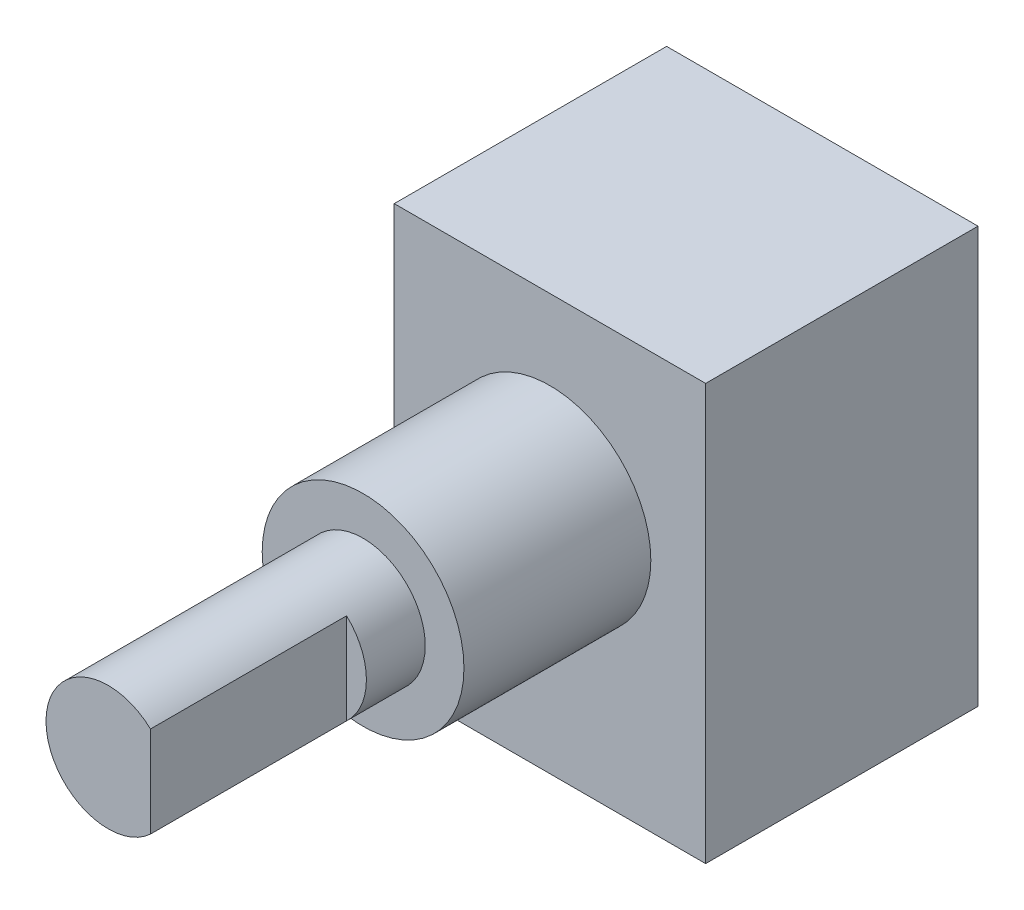
ISO-10303-21;
HEADER;
FILE_DESCRIPTION(('STEP AP214'),'2;1');
FILE_NAME('part.step','',(''),(''),'','','');
FILE_SCHEMA(('AUTOMOTIVE_DESIGN { 1 0 10303 214 1 1 1 1 }'));
ENDSEC;
DATA;
#1=APPLICATION_CONTEXT('core data for automotive mechanical design processes');
#2=APPLICATION_PROTOCOL_DEFINITION('international standard','automotive_design',2000,#1);
#3=PRODUCT_CONTEXT('',#1,'mechanical');
#4=PRODUCT('Part','Part','',(#3));
#5=PRODUCT_RELATED_PRODUCT_CATEGORY('part','',(#4));
#6=PRODUCT_DEFINITION_FORMATION('','',#4);
#7=PRODUCT_DEFINITION_CONTEXT('part definition',#1,'design');
#8=PRODUCT_DEFINITION('design','',#6,#7);
#9=PRODUCT_DEFINITION_SHAPE('','',#8);
#10=(LENGTH_UNIT() NAMED_UNIT(*) SI_UNIT(.MILLI.,.METRE.));
#11=(NAMED_UNIT(*) PLANE_ANGLE_UNIT() SI_UNIT($,.RADIAN.));
#12=(NAMED_UNIT(*) SI_UNIT($,.STERADIAN.) SOLID_ANGLE_UNIT());
#13=UNCERTAINTY_MEASURE_WITH_UNIT(LENGTH_MEASURE(1.E-05),#10,'distance_accuracy_value','');
#14=(GEOMETRIC_REPRESENTATION_CONTEXT(3) GLOBAL_UNCERTAINTY_ASSIGNED_CONTEXT((#13)) GLOBAL_UNIT_ASSIGNED_CONTEXT((#10,
#11,#12)) REPRESENTATION_CONTEXT('',''));
#15=CARTESIAN_POINT('',(0.,0.,0.));
#16=DIRECTION('',(0.,0.,1.));
#17=DIRECTION('',(1.,0.,0.));
#18=AXIS2_PLACEMENT_3D('',#15,#16,#17);
#19=CARTESIAN_POINT('',(0.,0.,13.89));
#20=DIRECTION('',(1.,0.,0.));
#21=DIRECTION('',(0.,0.,-1.));
#22=AXIS2_PLACEMENT_3D('',#19,#20,#21);
#23=PLANE('',#22);
#24=DIRECTION('',(0.,-1.,0.));
#25=VECTOR('',#24,1.);
#26=CARTESIAN_POINT('',(0.,0.,0.));
#27=LINE('',#26,#25);
#28=CARTESIAN_POINT('',(0.,21.21,0.));
#29=VERTEX_POINT('',#28);
#30=CARTESIAN_POINT('',(0.,0.,0.));
#31=VERTEX_POINT('',#30);
#32=EDGE_CURVE('E125',#29,#31,#27,.T.);
#33=ORIENTED_EDGE('',*,*,#32,.T.);
#34=DIRECTION('',(0.,0.,-1.));
#35=VECTOR('',#34,1.);
#36=CARTESIAN_POINT('',(0.,0.,13.89));
#37=LINE('',#36,#35);
#38=CARTESIAN_POINT('',(0.,0.,13.89));
#39=VERTEX_POINT('',#38);
#40=EDGE_CURVE('E134',#39,#31,#37,.T.);
#41=ORIENTED_EDGE('',*,*,#40,.F.);
#42=DIRECTION('',(0.,-1.,0.));
#43=VECTOR('',#42,1.);
#44=CARTESIAN_POINT('',(0.,0.,13.89));
#45=LINE('',#44,#43);
#46=CARTESIAN_POINT('',(0.,21.21,13.89));
#47=VERTEX_POINT('',#46);
#48=EDGE_CURVE('E135',#47,#39,#45,.T.);
#49=ORIENTED_EDGE('',*,*,#48,.F.);
#50=DIRECTION('',(0.,0.,-1.));
#51=VECTOR('',#50,1.);
#52=CARTESIAN_POINT('',(0.,21.21,13.89));
#53=LINE('',#52,#51);
#54=EDGE_CURVE('E145',#47,#29,#53,.T.);
#55=ORIENTED_EDGE('',*,*,#54,.T.);
#56=EDGE_LOOP('',(#33,#41,#49,#55));
#57=FACE_BOUND('',#56,.T.);
#58=ADVANCED_FACE('F41',(#57),#23,.F.);
#59=CARTESIAN_POINT('',(0.,0.,13.89));
#60=DIRECTION('',(0.,1.,0.));
#61=DIRECTION('',(0.,0.,1.));
#62=AXIS2_PLACEMENT_3D('',#59,#60,#61);
#63=PLANE('',#62);
#64=DIRECTION('',(1.,0.,0.));
#65=VECTOR('',#64,1.);
#66=CARTESIAN_POINT('',(0.,0.,0.));
#67=LINE('',#66,#65);
#68=CARTESIAN_POINT('',(15.88,0.,0.));
#69=VERTEX_POINT('',#68);
#70=EDGE_CURVE('E149',#31,#69,#67,.T.);
#71=ORIENTED_EDGE('',*,*,#70,.T.);
#72=DIRECTION('',(0.,0.,-1.));
#73=VECTOR('',#72,1.);
#74=CARTESIAN_POINT('',(15.88,0.,13.89));
#75=LINE('',#74,#73);
#76=CARTESIAN_POINT('',(15.88,0.,13.89));
#77=VERTEX_POINT('',#76);
#78=EDGE_CURVE('E162',#77,#69,#75,.T.);
#79=ORIENTED_EDGE('',*,*,#78,.F.);
#80=DIRECTION('',(1.,0.,0.));
#81=VECTOR('',#80,1.);
#82=CARTESIAN_POINT('',(0.,0.,13.89));
#83=LINE('',#82,#81);
#84=EDGE_CURVE('E94',#39,#77,#83,.T.);
#85=ORIENTED_EDGE('',*,*,#84,.F.);
#86=ORIENTED_EDGE('',*,*,#40,.T.);
#87=EDGE_LOOP('',(#71,#79,#85,#86));
#88=FACE_BOUND('',#87,.T.);
#89=ADVANCED_FACE('F168',(#88),#63,.F.);
#90=CARTESIAN_POINT('',(15.88,0.,13.89));
#91=DIRECTION('',(-1.,0.,0.));
#92=DIRECTION('',(0.,0.,1.));
#93=AXIS2_PLACEMENT_3D('',#90,#91,#92);
#94=PLANE('',#93);
#95=DIRECTION('',(0.,1.,0.));
#96=VECTOR('',#95,1.);
#97=CARTESIAN_POINT('',(15.88,0.,0.));
#98=LINE('',#97,#96);
#99=CARTESIAN_POINT('',(15.88,21.21,0.));
#100=VERTEX_POINT('',#99);
#101=EDGE_CURVE('E152',#69,#100,#98,.T.);
#102=ORIENTED_EDGE('',*,*,#101,.T.);
#103=DIRECTION('',(0.,0.,-1.));
#104=VECTOR('',#103,1.);
#105=CARTESIAN_POINT('',(15.88,21.21,13.89));
#106=LINE('',#105,#104);
#107=CARTESIAN_POINT('',(15.88,21.21,13.89));
#108=VERTEX_POINT('',#107);
#109=EDGE_CURVE('E159',#108,#100,#106,.T.);
#110=ORIENTED_EDGE('',*,*,#109,.F.);
#111=DIRECTION('',(0.,1.,0.));
#112=VECTOR('',#111,1.);
#113=CARTESIAN_POINT('',(15.88,0.,13.89));
#114=LINE('',#113,#112);
#115=EDGE_CURVE('E140',#77,#108,#114,.T.);
#116=ORIENTED_EDGE('',*,*,#115,.F.);
#117=ORIENTED_EDGE('',*,*,#78,.T.);
#118=EDGE_LOOP('',(#102,#110,#116,#117));
#119=FACE_BOUND('',#118,.T.);
#120=ADVANCED_FACE('F177',(#119),#94,.F.);
#121=CARTESIAN_POINT('',(0.,21.21,13.89));
#122=DIRECTION('',(0.,-1.,0.));
#123=DIRECTION('',(0.,0.,-1.));
#124=AXIS2_PLACEMENT_3D('',#121,#122,#123);
#125=PLANE('',#124);
#126=DIRECTION('',(-1.,0.,0.));
#127=VECTOR('',#126,1.);
#128=CARTESIAN_POINT('',(0.,21.21,0.));
#129=LINE('',#128,#127);
#130=EDGE_CURVE('E86',#100,#29,#129,.T.);
#131=ORIENTED_EDGE('',*,*,#130,.T.);
#132=ORIENTED_EDGE('',*,*,#54,.F.);
#133=DIRECTION('',(-1.,0.,0.));
#134=VECTOR('',#133,1.);
#135=CARTESIAN_POINT('',(0.,21.21,13.89));
#136=LINE('',#135,#134);
#137=EDGE_CURVE('E65',#108,#47,#136,.T.);
#138=ORIENTED_EDGE('',*,*,#137,.F.);
#139=ORIENTED_EDGE('',*,*,#109,.T.);
#140=EDGE_LOOP('',(#131,#132,#138,#139));
#141=FACE_BOUND('',#140,.T.);
#142=ADVANCED_FACE('F179',(#141),#125,.F.);
#143=CARTESIAN_POINT('',(0.,0.,13.89));
#144=DIRECTION('',(0.,0.,-1.));
#145=DIRECTION('',(-1.,0.,0.));
#146=AXIS2_PLACEMENT_3D('',#143,#144,#145);
#147=PLANE('',#146);
#148=CARTESIAN_POINT('',(7.94,12.,13.89));
#149=DIRECTION('',(0.,0.,1.));
#150=DIRECTION('',(1.,0.,0.));
#151=AXIS2_PLACEMENT_3D('',#148,#149,#150);
#152=CIRCLE('',#151,5.145);
#153=CARTESIAN_POINT('',(13.085,12.,13.89));
#154=VERTEX_POINT('',#153);
#155=EDGE_CURVE('E130',#154,#154,#152,.T.);
#156=ORIENTED_EDGE('',*,*,#155,.F.);
#157=EDGE_LOOP('',(#156));
#158=FACE_BOUND('',#157,.T.);
#159=ORIENTED_EDGE('',*,*,#48,.T.);
#160=ORIENTED_EDGE('',*,*,#84,.T.);
#161=ORIENTED_EDGE('',*,*,#115,.T.);
#162=ORIENTED_EDGE('',*,*,#137,.T.);
#163=EDGE_LOOP('',(#159,#160,#161,#162));
#164=FACE_BOUND('',#163,.T.);
#165=ADVANCED_FACE('F180',(#158,#164),#147,.F.);
#166=CARTESIAN_POINT('',(0.,0.,0.));
#167=DIRECTION('',(0.,0.,-1.));
#168=DIRECTION('',(-1.,0.,0.));
#169=AXIS2_PLACEMENT_3D('',#166,#167,#168);
#170=PLANE('',#169);
#171=ORIENTED_EDGE('',*,*,#32,.F.);
#172=ORIENTED_EDGE('',*,*,#130,.F.);
#173=ORIENTED_EDGE('',*,*,#101,.F.);
#174=ORIENTED_EDGE('',*,*,#70,.F.);
#175=EDGE_LOOP('',(#171,#172,#173,#174));
#176=FACE_BOUND('',#175,.T.);
#177=ADVANCED_FACE('F173',(#176),#170,.T.);
#178=CARTESIAN_POINT('',(7.94,12.,23.42));
#179=DIRECTION('',(0.,0.,-1.));
#180=DIRECTION('',(-1.,0.,0.));
#181=AXIS2_PLACEMENT_3D('',#178,#179,#180);
#182=CYLINDRICAL_SURFACE('',#181,5.145);
#183=CARTESIAN_POINT('',(7.94,12.,23.42));
#184=DIRECTION('',(0.,0.,1.));
#185=DIRECTION('',(1.,0.,0.));
#186=AXIS2_PLACEMENT_3D('',#183,#184,#185);
#187=CIRCLE('',#186,5.145);
#188=CARTESIAN_POINT('',(13.085,12.,23.42));
#189=VERTEX_POINT('',#188);
#190=EDGE_CURVE('E120',#189,#189,#187,.T.);
#191=ORIENTED_EDGE('',*,*,#190,.F.);
#192=EDGE_LOOP('',(#191));
#193=FACE_BOUND('',#192,.T.);
#194=ORIENTED_EDGE('',*,*,#155,.T.);
#195=EDGE_LOOP('',(#194));
#196=FACE_BOUND('',#195,.T.);
#197=ADVANCED_FACE('F188',(#193,#196),#182,.T.);
#198=CARTESIAN_POINT('',(7.94,12.,23.42));
#199=DIRECTION('',(0.,0.,1.));
#200=DIRECTION('',(1.,0.,0.));
#201=AXIS2_PLACEMENT_3D('',#198,#199,#200);
#202=PLANE('',#201);
#203=CARTESIAN_POINT('',(7.94,12.,23.42));
#204=DIRECTION('',(0.,0.,1.));
#205=DIRECTION('',(1.,0.,0.));
#206=AXIS2_PLACEMENT_3D('',#203,#204,#205);
#207=CIRCLE('',#206,3.17);
#208=CARTESIAN_POINT('',(11.11,12.,23.42));
#209=VERTEX_POINT('',#208);
#210=EDGE_CURVE('E109',#209,#209,#207,.T.);
#211=ORIENTED_EDGE('',*,*,#210,.F.);
#212=EDGE_LOOP('',(#211));
#213=FACE_BOUND('',#212,.T.);
#214=ORIENTED_EDGE('',*,*,#190,.T.);
#215=EDGE_LOOP('',(#214));
#216=FACE_BOUND('',#215,.T.);
#217=ADVANCED_FACE('F226',(#213,#216),#202,.T.);
#218=CARTESIAN_POINT('',(7.94,12.,67.9161139854454));
#219=DIRECTION('',(0.,0.,-1.));
#220=DIRECTION('',(-1.,0.,0.));
#221=AXIS2_PLACEMENT_3D('',#218,#219,#220);
#222=CYLINDRICAL_SURFACE('',#221,3.17);
#223=CARTESIAN_POINT('',(7.94,12.,36.42));
#224=DIRECTION('',(0.,0.,-1.));
#225=DIRECTION('',(-1.,0.,0.));
#226=AXIS2_PLACEMENT_3D('',#223,#224,#225);
#227=CIRCLE('',#226,3.17);
#228=CARTESIAN_POINT('',(10.099,9.67887548804464,36.42));
#229=VERTEX_POINT('',#228);
#230=CARTESIAN_POINT('',(10.099,14.3211245119554,36.42));
#231=VERTEX_POINT('',#230);
#232=EDGE_CURVE('E114',#229,#231,#227,.T.);
#233=ORIENTED_EDGE('',*,*,#232,.T.);
#234=DIRECTION('',(0.,0.,-1.));
#235=VECTOR('',#234,1.);
#236=CARTESIAN_POINT('',(10.099,14.3211245119554,67.9161139854454));
#237=LINE('',#236,#235);
#238=CARTESIAN_POINT('',(10.099,14.3211245119554,26.42));
#239=VERTEX_POINT('',#238);
#240=EDGE_CURVE('E56',#231,#239,#237,.T.);
#241=ORIENTED_EDGE('',*,*,#240,.T.);
#242=CARTESIAN_POINT('',(7.94,12.,26.42));
#243=DIRECTION('',(0.,0.,1.));
#244=DIRECTION('',(1.,0.,0.));
#245=AXIS2_PLACEMENT_3D('',#242,#243,#244);
#246=CIRCLE('',#245,3.17);
#247=CARTESIAN_POINT('',(10.099,9.67887548804464,26.42));
#248=VERTEX_POINT('',#247);
#249=EDGE_CURVE('E12',#248,#239,#246,.T.);
#250=ORIENTED_EDGE('',*,*,#249,.F.);
#251=DIRECTION('',(0.,0.,-1.));
#252=VECTOR('',#251,1.);
#253=CARTESIAN_POINT('',(10.099,9.67887548804464,67.9161139854454));
#254=LINE('',#253,#252);
#255=EDGE_CURVE('E103',#248,#229,#254,.F.);
#256=ORIENTED_EDGE('',*,*,#255,.T.);
#257=EDGE_LOOP('',(#233,#241,#250,#256));
#258=FACE_BOUND('',#257,.T.);
#259=ORIENTED_EDGE('',*,*,#210,.T.);
#260=EDGE_LOOP('',(#259));
#261=FACE_BOUND('',#260,.T.);
#262=ADVANCED_FACE('F112',(#258,#261),#222,.T.);
#263=CARTESIAN_POINT('',(0.,0.,36.42));
#264=DIRECTION('',(0.,0.,-1.));
#265=DIRECTION('',(-1.,0.,0.));
#266=AXIS2_PLACEMENT_3D('',#263,#264,#265);
#267=PLANE('',#266);
#268=ORIENTED_EDGE('',*,*,#232,.F.);
#269=DIRECTION('',(0.,1.,0.));
#270=VECTOR('',#269,1.);
#271=CARTESIAN_POINT('',(10.099,0.,36.42));
#272=LINE('',#271,#270);
#273=EDGE_CURVE('E49',#229,#231,#272,.T.);
#274=ORIENTED_EDGE('',*,*,#273,.T.);
#275=EDGE_LOOP('',(#268,#274));
#276=FACE_BOUND('',#275,.T.);
#277=ADVANCED_FACE('F118',(#276),#267,.F.);
#278=CARTESIAN_POINT('',(7.94,12.,26.42));
#279=DIRECTION('',(0.,0.,1.));
#280=DIRECTION('',(1.,0.,0.));
#281=AXIS2_PLACEMENT_3D('',#278,#279,#280);
#282=PLANE('',#281);
#283=ORIENTED_EDGE('',*,*,#249,.T.);
#284=DIRECTION('',(0.,-1.,0.));
#285=VECTOR('',#284,1.);
#286=CARTESIAN_POINT('',(10.099,14.3279484530376,26.42));
#287=LINE('',#286,#285);
#288=EDGE_CURVE('E116',#239,#248,#287,.T.);
#289=ORIENTED_EDGE('',*,*,#288,.T.);
#290=EDGE_LOOP('',(#283,#289));
#291=FACE_BOUND('',#290,.T.);
#292=ADVANCED_FACE('F249',(#291),#282,.T.);
#293=CARTESIAN_POINT('',(10.099,14.3279484530376,26.42));
#294=DIRECTION('',(-1.,0.,0.));
#295=DIRECTION('',(0.,-1.,0.));
#296=AXIS2_PLACEMENT_3D('',#293,#294,#295);
#297=PLANE('',#296);
#298=ORIENTED_EDGE('',*,*,#273,.F.);
#299=ORIENTED_EDGE('',*,*,#255,.F.);
#300=ORIENTED_EDGE('',*,*,#288,.F.);
#301=ORIENTED_EDGE('',*,*,#240,.F.);
#302=EDGE_LOOP('',(#298,#299,#300,#301));
#303=FACE_BOUND('',#302,.T.);
#304=ADVANCED_FACE('F102',(#303),#297,.F.);
#305=CLOSED_SHELL('',(#58,#89,#120,#142,#165,#177,#197,#217,#262,#277,#292,#304));
#306=MANIFOLD_SOLID_BREP('B2',#305);
#307=ADVANCED_BREP_SHAPE_REPRESENTATION('',(#18,#306),#14);
#308=SHAPE_DEFINITION_REPRESENTATION(#9,#307);
ENDSEC;
END-ISO-10303-21;
